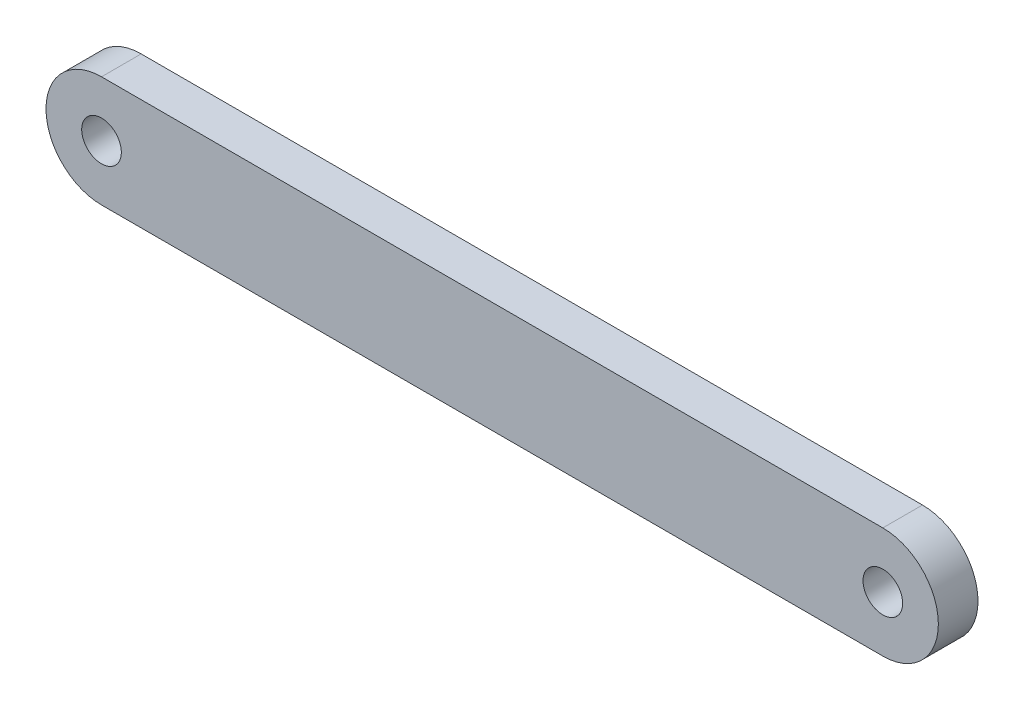
ISO-10303-21;
HEADER;
FILE_DESCRIPTION(('STEP AP214'),'2;1');
FILE_NAME('part.step','',(''),(''),'','','');
FILE_SCHEMA(('AUTOMOTIVE_DESIGN { 1 0 10303 214 1 1 1 1 }'));
ENDSEC;
DATA;
#1=APPLICATION_CONTEXT('core data for automotive mechanical design processes');
#2=APPLICATION_PROTOCOL_DEFINITION('international standard','automotive_design',2000,#1);
#3=PRODUCT_CONTEXT('',#1,'mechanical');
#4=PRODUCT('Part','Part','',(#3));
#5=PRODUCT_RELATED_PRODUCT_CATEGORY('part','',(#4));
#6=PRODUCT_DEFINITION_FORMATION('','',#4);
#7=PRODUCT_DEFINITION_CONTEXT('part definition',#1,'design');
#8=PRODUCT_DEFINITION('design','',#6,#7);
#9=PRODUCT_DEFINITION_SHAPE('','',#8);
#10=(LENGTH_UNIT() NAMED_UNIT(*) SI_UNIT(.MILLI.,.METRE.));
#11=(NAMED_UNIT(*) PLANE_ANGLE_UNIT() SI_UNIT($,.RADIAN.));
#12=(NAMED_UNIT(*) SI_UNIT($,.STERADIAN.) SOLID_ANGLE_UNIT());
#13=UNCERTAINTY_MEASURE_WITH_UNIT(LENGTH_MEASURE(1.E-05),#10,'distance_accuracy_value','');
#14=(GEOMETRIC_REPRESENTATION_CONTEXT(3) GLOBAL_UNCERTAINTY_ASSIGNED_CONTEXT((#13)) GLOBAL_UNIT_ASSIGNED_CONTEXT((#10,
#11,#12)) REPRESENTATION_CONTEXT('',''));
#15=CARTESIAN_POINT('',(0.,0.,0.));
#16=DIRECTION('',(0.,0.,1.));
#17=DIRECTION('',(1.,0.,0.));
#18=AXIS2_PLACEMENT_3D('',#15,#16,#17);
#19=CARTESIAN_POINT('',(75.2094,0.116697774587227,6.35));
#20=DIRECTION('',(0.,0.,-1.));
#21=DIRECTION('',(-1.,0.,0.));
#22=AXIS2_PLACEMENT_3D('',#19,#20,#21);
#23=PLANE('',#22);
#24=CARTESIAN_POINT('',(75.2094,0.116697774587227,6.35));
#25=DIRECTION('',(0.,0.,1.));
#26=DIRECTION('',(-1.,0.,0.));
#27=AXIS2_PLACEMENT_3D('',#24,#25,#26);
#28=CIRCLE('',#27,8.89);
#29=CARTESIAN_POINT('',(75.2094,-8.77330222541277,6.35));
#30=VERTEX_POINT('',#29);
#31=CARTESIAN_POINT('',(75.2094,9.00669777458723,6.35));
#32=VERTEX_POINT('',#31);
#33=EDGE_CURVE('E97',#30,#32,#28,.T.);
#34=ORIENTED_EDGE('',*,*,#33,.T.);
#35=DIRECTION('',(-1.,0.,0.));
#36=VECTOR('',#35,1.);
#37=CARTESIAN_POINT('',(-49.911,9.00669777458723,6.35));
#38=LINE('',#37,#36);
#39=CARTESIAN_POINT('',(-49.911,9.00669777458723,6.35));
#40=VERTEX_POINT('',#39);
#41=EDGE_CURVE('E93',#32,#40,#38,.T.);
#42=ORIENTED_EDGE('',*,*,#41,.T.);
#43=CARTESIAN_POINT('',(-49.911,0.116697774587227,6.35));
#44=DIRECTION('',(0.,0.,1.));
#45=DIRECTION('',(1.,0.,0.));
#46=AXIS2_PLACEMENT_3D('',#43,#44,#45);
#47=CIRCLE('',#46,8.89);
#48=CARTESIAN_POINT('',(-49.911,-8.77330222541277,6.35));
#49=VERTEX_POINT('',#48);
#50=EDGE_CURVE('E96',#40,#49,#47,.T.);
#51=ORIENTED_EDGE('',*,*,#50,.T.);
#52=DIRECTION('',(1.,0.,0.));
#53=VECTOR('',#52,1.);
#54=CARTESIAN_POINT('',(-49.911,-8.77330222541277,6.35));
#55=LINE('',#54,#53);
#56=EDGE_CURVE('E63',#49,#30,#55,.T.);
#57=ORIENTED_EDGE('',*,*,#56,.T.);
#58=EDGE_LOOP('',(#34,#42,#51,#57));
#59=FACE_BOUND('',#58,.T.);
#60=CARTESIAN_POINT('',(-49.911,0.116697774587227,6.35));
#61=DIRECTION('',(0.,0.,1.));
#62=DIRECTION('',(1.,0.,0.));
#63=AXIS2_PLACEMENT_3D('',#60,#61,#62);
#64=CIRCLE('',#63,3.175);
#65=CARTESIAN_POINT('',(-46.736,0.116697774587227,6.35));
#66=VERTEX_POINT('',#65);
#67=EDGE_CURVE('E118',#66,#66,#64,.T.);
#68=ORIENTED_EDGE('',*,*,#67,.F.);
#69=EDGE_LOOP('',(#68));
#70=FACE_BOUND('',#69,.T.);
#71=CARTESIAN_POINT('',(75.2094,0.116697774587227,6.35));
#72=DIRECTION('',(0.,0.,1.));
#73=DIRECTION('',(1.,0.,0.));
#74=AXIS2_PLACEMENT_3D('',#71,#72,#73);
#75=CIRCLE('',#74,3.175);
#76=CARTESIAN_POINT('',(78.3844,0.116697774587227,6.35));
#77=VERTEX_POINT('',#76);
#78=EDGE_CURVE('E139',#77,#77,#75,.T.);
#79=ORIENTED_EDGE('',*,*,#78,.F.);
#80=EDGE_LOOP('',(#79));
#81=FACE_BOUND('',#80,.T.);
#82=ADVANCED_FACE('F44',(#59,#70,#81),#23,.F.);
#83=CARTESIAN_POINT('',(75.2094,0.116697774587227,0.));
#84=DIRECTION('',(0.,0.,-1.));
#85=DIRECTION('',(-1.,0.,0.));
#86=AXIS2_PLACEMENT_3D('',#83,#84,#85);
#87=PLANE('',#86);
#88=CARTESIAN_POINT('',(-49.911,0.116697774587227,0.));
#89=DIRECTION('',(0.,0.,1.));
#90=DIRECTION('',(1.,0.,0.));
#91=AXIS2_PLACEMENT_3D('',#88,#89,#90);
#92=CIRCLE('',#91,3.175);
#93=CARTESIAN_POINT('',(-46.736,0.116697774587227,0.));
#94=VERTEX_POINT('',#93);
#95=EDGE_CURVE('E136',#94,#94,#92,.T.);
#96=ORIENTED_EDGE('',*,*,#95,.T.);
#97=EDGE_LOOP('',(#96));
#98=FACE_BOUND('',#97,.T.);
#99=CARTESIAN_POINT('',(75.2094,0.116697774587227,0.));
#100=DIRECTION('',(0.,0.,1.));
#101=DIRECTION('',(-1.,0.,0.));
#102=AXIS2_PLACEMENT_3D('',#99,#100,#101);
#103=CIRCLE('',#102,8.89);
#104=CARTESIAN_POINT('',(75.2094,-8.77330222541277,0.));
#105=VERTEX_POINT('',#104);
#106=CARTESIAN_POINT('',(75.2094,9.00669777458723,0.));
#107=VERTEX_POINT('',#106);
#108=EDGE_CURVE('E114',#105,#107,#103,.T.);
#109=ORIENTED_EDGE('',*,*,#108,.F.);
#110=DIRECTION('',(1.,0.,0.));
#111=VECTOR('',#110,1.);
#112=CARTESIAN_POINT('',(-49.911,-8.77330222541277,0.));
#113=LINE('',#112,#111);
#114=CARTESIAN_POINT('',(-49.911,-8.77330222541277,0.));
#115=VERTEX_POINT('',#114);
#116=EDGE_CURVE('E86',#115,#105,#113,.T.);
#117=ORIENTED_EDGE('',*,*,#116,.F.);
#118=CARTESIAN_POINT('',(-49.911,0.116697774587227,0.));
#119=DIRECTION('',(0.,0.,1.));
#120=DIRECTION('',(1.,0.,0.));
#121=AXIS2_PLACEMENT_3D('',#118,#119,#120);
#122=CIRCLE('',#121,8.89);
#123=CARTESIAN_POINT('',(-49.911,9.00669777458723,0.));
#124=VERTEX_POINT('',#123);
#125=EDGE_CURVE('E79',#124,#115,#122,.T.);
#126=ORIENTED_EDGE('',*,*,#125,.F.);
#127=DIRECTION('',(-1.,0.,0.));
#128=VECTOR('',#127,1.);
#129=CARTESIAN_POINT('',(-49.911,9.00669777458723,0.));
#130=LINE('',#129,#128);
#131=EDGE_CURVE('E104',#107,#124,#130,.T.);
#132=ORIENTED_EDGE('',*,*,#131,.F.);
#133=EDGE_LOOP('',(#109,#117,#126,#132));
#134=FACE_BOUND('',#133,.T.);
#135=CARTESIAN_POINT('',(75.2094,0.116697774587227,0.));
#136=DIRECTION('',(0.,0.,1.));
#137=DIRECTION('',(1.,0.,0.));
#138=AXIS2_PLACEMENT_3D('',#135,#136,#137);
#139=CIRCLE('',#138,3.175);
#140=CARTESIAN_POINT('',(78.3844,0.116697774587227,0.));
#141=VERTEX_POINT('',#140);
#142=EDGE_CURVE('E143',#141,#141,#139,.T.);
#143=ORIENTED_EDGE('',*,*,#142,.T.);
#144=EDGE_LOOP('',(#143));
#145=FACE_BOUND('',#144,.T.);
#146=ADVANCED_FACE('F131',(#98,#134,#145),#87,.T.);
#147=CARTESIAN_POINT('',(75.2094,0.116697774587227,6.35));
#148=DIRECTION('',(0.,0.,-1.));
#149=DIRECTION('',(-1.,0.,0.));
#150=AXIS2_PLACEMENT_3D('',#147,#148,#149);
#151=CYLINDRICAL_SURFACE('',#150,8.89);
#152=ORIENTED_EDGE('',*,*,#108,.T.);
#153=DIRECTION('',(0.,0.,-1.));
#154=VECTOR('',#153,1.);
#155=CARTESIAN_POINT('',(75.2094,9.00669777458723,6.35));
#156=LINE('',#155,#154);
#157=EDGE_CURVE('E11',#32,#107,#156,.T.);
#158=ORIENTED_EDGE('',*,*,#157,.F.);
#159=ORIENTED_EDGE('',*,*,#33,.F.);
#160=DIRECTION('',(0.,0.,-1.));
#161=VECTOR('',#160,1.);
#162=CARTESIAN_POINT('',(75.2094,-8.77330222541277,6.35));
#163=LINE('',#162,#161);
#164=EDGE_CURVE('E106',#30,#105,#163,.T.);
#165=ORIENTED_EDGE('',*,*,#164,.T.);
#166=EDGE_LOOP('',(#152,#158,#159,#165));
#167=FACE_BOUND('',#166,.T.);
#168=ADVANCED_FACE('F50',(#167),#151,.T.);
#169=CARTESIAN_POINT('',(-49.911,9.00669777458723,6.35));
#170=DIRECTION('',(0.,-1.,0.));
#171=DIRECTION('',(0.,0.,-1.));
#172=AXIS2_PLACEMENT_3D('',#169,#170,#171);
#173=PLANE('',#172);
#174=ORIENTED_EDGE('',*,*,#131,.T.);
#175=DIRECTION('',(0.,0.,-1.));
#176=VECTOR('',#175,1.);
#177=CARTESIAN_POINT('',(-49.911,9.00669777458723,6.35));
#178=LINE('',#177,#176);
#179=EDGE_CURVE('E54',#40,#124,#178,.T.);
#180=ORIENTED_EDGE('',*,*,#179,.F.);
#181=ORIENTED_EDGE('',*,*,#41,.F.);
#182=ORIENTED_EDGE('',*,*,#157,.T.);
#183=EDGE_LOOP('',(#174,#180,#181,#182));
#184=FACE_BOUND('',#183,.T.);
#185=ADVANCED_FACE('F105',(#184),#173,.F.);
#186=CARTESIAN_POINT('',(-49.911,0.116697774587227,6.35));
#187=DIRECTION('',(0.,0.,-1.));
#188=DIRECTION('',(-1.,0.,0.));
#189=AXIS2_PLACEMENT_3D('',#186,#187,#188);
#190=CYLINDRICAL_SURFACE('',#189,8.89);
#191=ORIENTED_EDGE('',*,*,#125,.T.);
#192=DIRECTION('',(0.,0.,-1.));
#193=VECTOR('',#192,1.);
#194=CARTESIAN_POINT('',(-49.911,-8.77330222541277,6.35));
#195=LINE('',#194,#193);
#196=EDGE_CURVE('E103',#49,#115,#195,.T.);
#197=ORIENTED_EDGE('',*,*,#196,.F.);
#198=ORIENTED_EDGE('',*,*,#50,.F.);
#199=ORIENTED_EDGE('',*,*,#179,.T.);
#200=EDGE_LOOP('',(#191,#197,#198,#199));
#201=FACE_BOUND('',#200,.T.);
#202=ADVANCED_FACE('F107',(#201),#190,.T.);
#203=CARTESIAN_POINT('',(-49.911,-8.77330222541277,6.35));
#204=DIRECTION('',(0.,1.,0.));
#205=DIRECTION('',(0.,0.,1.));
#206=AXIS2_PLACEMENT_3D('',#203,#204,#205);
#207=PLANE('',#206);
#208=ORIENTED_EDGE('',*,*,#116,.T.);
#209=ORIENTED_EDGE('',*,*,#164,.F.);
#210=ORIENTED_EDGE('',*,*,#56,.F.);
#211=ORIENTED_EDGE('',*,*,#196,.T.);
#212=EDGE_LOOP('',(#208,#209,#210,#211));
#213=FACE_BOUND('',#212,.T.);
#214=ADVANCED_FACE('F126',(#213),#207,.F.);
#215=CARTESIAN_POINT('',(-49.911,0.116697774587227,6.35));
#216=DIRECTION('',(0.,0.,-1.));
#217=DIRECTION('',(-1.,0.,0.));
#218=AXIS2_PLACEMENT_3D('',#215,#216,#217);
#219=CYLINDRICAL_SURFACE('',#218,3.175);
#220=ORIENTED_EDGE('',*,*,#67,.T.);
#221=EDGE_LOOP('',(#220));
#222=FACE_BOUND('',#221,.T.);
#223=ORIENTED_EDGE('',*,*,#95,.F.);
#224=EDGE_LOOP('',(#223));
#225=FACE_BOUND('',#224,.T.);
#226=ADVANCED_FACE('F163',(#222,#225),#219,.F.);
#227=CARTESIAN_POINT('',(75.2094,0.116697774587227,6.35));
#228=DIRECTION('',(0.,0.,-1.));
#229=DIRECTION('',(-1.,0.,0.));
#230=AXIS2_PLACEMENT_3D('',#227,#228,#229);
#231=CYLINDRICAL_SURFACE('',#230,3.175);
#232=ORIENTED_EDGE('',*,*,#78,.T.);
#233=EDGE_LOOP('',(#232));
#234=FACE_BOUND('',#233,.T.);
#235=ORIENTED_EDGE('',*,*,#142,.F.);
#236=EDGE_LOOP('',(#235));
#237=FACE_BOUND('',#236,.T.);
#238=ADVANCED_FACE('F155',(#234,#237),#231,.F.);
#239=CLOSED_SHELL('',(#82,#146,#168,#185,#202,#214,#226,#238));
#240=MANIFOLD_SOLID_BREP('B2',#239);
#241=ADVANCED_BREP_SHAPE_REPRESENTATION('',(#18,#240),#14);
#242=SHAPE_DEFINITION_REPRESENTATION(#9,#241);
ENDSEC;
END-ISO-10303-21;
